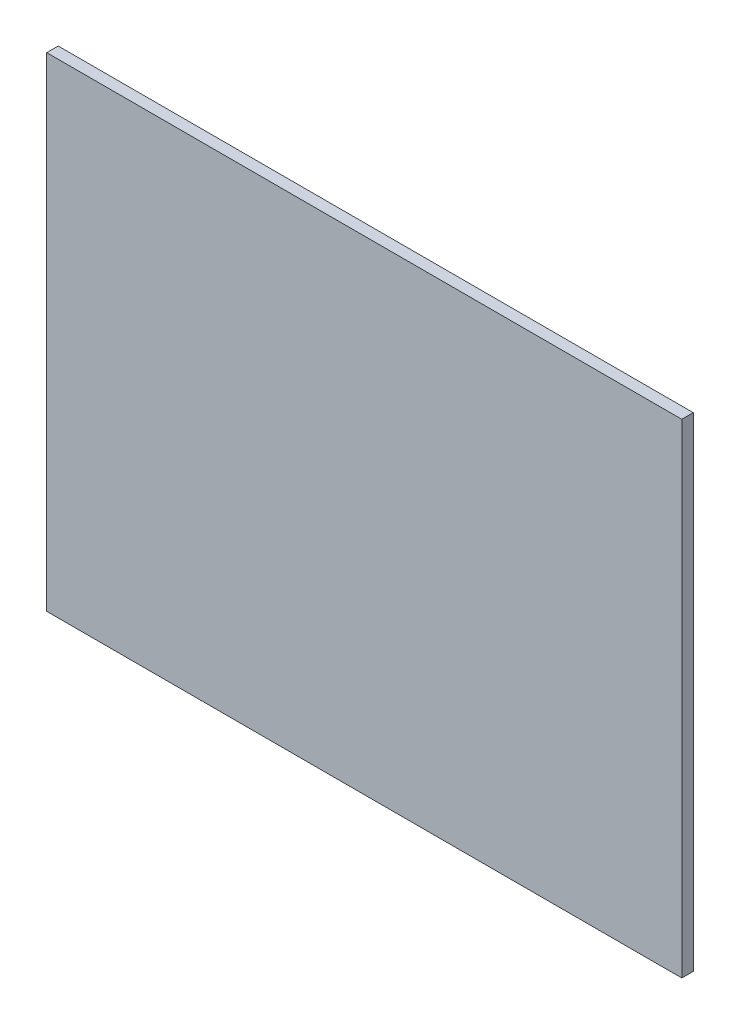
ISO-10303-21;
HEADER;
FILE_DESCRIPTION(('STEP AP214'),'2;1');
FILE_NAME('part.step','',(''),(''),'','','');
FILE_SCHEMA(('AUTOMOTIVE_DESIGN { 1 0 10303 214 1 1 1 1 }'));
ENDSEC;
DATA;
#1=APPLICATION_CONTEXT('core data for automotive mechanical design processes');
#2=APPLICATION_PROTOCOL_DEFINITION('international standard','automotive_design',2000,#1);
#3=PRODUCT_CONTEXT('',#1,'mechanical');
#4=PRODUCT('Part','Part','',(#3));
#5=PRODUCT_RELATED_PRODUCT_CATEGORY('part','',(#4));
#6=PRODUCT_DEFINITION_FORMATION('','',#4);
#7=PRODUCT_DEFINITION_CONTEXT('part definition',#1,'design');
#8=PRODUCT_DEFINITION('design','',#6,#7);
#9=PRODUCT_DEFINITION_SHAPE('','',#8);
#10=(LENGTH_UNIT() NAMED_UNIT(*) SI_UNIT(.MILLI.,.METRE.));
#11=(NAMED_UNIT(*) PLANE_ANGLE_UNIT() SI_UNIT($,.RADIAN.));
#12=(NAMED_UNIT(*) SI_UNIT($,.STERADIAN.) SOLID_ANGLE_UNIT());
#13=UNCERTAINTY_MEASURE_WITH_UNIT(LENGTH_MEASURE(1.E-05),#10,'distance_accuracy_value','');
#14=(GEOMETRIC_REPRESENTATION_CONTEXT(3) GLOBAL_UNCERTAINTY_ASSIGNED_CONTEXT((#13)) GLOBAL_UNIT_ASSIGNED_CONTEXT((#10,
#11,#12)) REPRESENTATION_CONTEXT('',''));
#15=CARTESIAN_POINT('',(0.,0.,0.));
#16=DIRECTION('',(0.,0.,1.));
#17=DIRECTION('',(1.,0.,0.));
#18=AXIS2_PLACEMENT_3D('',#15,#16,#17);
#19=CARTESIAN_POINT('',(-525.,400.,9.5));
#20=DIRECTION('',(1.,0.,0.));
#21=DIRECTION('',(0.,1.,0.));
#22=AXIS2_PLACEMENT_3D('',#19,#20,#21);
#23=PLANE('',#22);
#24=DIRECTION('',(0.,-1.,0.));
#25=VECTOR('',#24,1.);
#26=CARTESIAN_POINT('',(-525.,400.,-9.5));
#27=LINE('',#26,#25);
#28=CARTESIAN_POINT('',(-525.,400.,-9.5));
#29=VERTEX_POINT('',#28);
#30=CARTESIAN_POINT('',(-525.,-400.,-9.5));
#31=VERTEX_POINT('',#30);
#32=EDGE_CURVE('E96',#29,#31,#27,.T.);
#33=ORIENTED_EDGE('',*,*,#32,.T.);
#34=DIRECTION('',(0.,0.,-1.));
#35=VECTOR('',#34,1.);
#36=CARTESIAN_POINT('',(-525.,-400.,9.5));
#37=LINE('',#36,#35);
#38=CARTESIAN_POINT('',(-525.,-400.,9.5));
#39=VERTEX_POINT('',#38);
#40=EDGE_CURVE('E11',#39,#31,#37,.T.);
#41=ORIENTED_EDGE('',*,*,#40,.F.);
#42=DIRECTION('',(0.,-1.,0.));
#43=VECTOR('',#42,1.);
#44=CARTESIAN_POINT('',(-525.,400.,9.5));
#45=LINE('',#44,#43);
#46=CARTESIAN_POINT('',(-525.,400.,9.5));
#47=VERTEX_POINT('',#46);
#48=EDGE_CURVE('E84',#47,#39,#45,.T.);
#49=ORIENTED_EDGE('',*,*,#48,.F.);
#50=DIRECTION('',(0.,0.,-1.));
#51=VECTOR('',#50,1.);
#52=CARTESIAN_POINT('',(-525.,400.,9.5));
#53=LINE('',#52,#51);
#54=EDGE_CURVE('E92',#47,#29,#53,.T.);
#55=ORIENTED_EDGE('',*,*,#54,.T.);
#56=EDGE_LOOP('',(#33,#41,#49,#55));
#57=FACE_BOUND('',#56,.T.);
#58=ADVANCED_FACE('F33',(#57),#23,.F.);
#59=CARTESIAN_POINT('',(525.,-400.,9.5));
#60=DIRECTION('',(0.,1.,0.));
#61=DIRECTION('',(-1.,0.,0.));
#62=AXIS2_PLACEMENT_3D('',#59,#60,#61);
#63=PLANE('',#62);
#64=DIRECTION('',(1.,0.,0.));
#65=VECTOR('',#64,1.);
#66=CARTESIAN_POINT('',(525.,-400.,-9.5));
#67=LINE('',#66,#65);
#68=CARTESIAN_POINT('',(525.,-400.,-9.5));
#69=VERTEX_POINT('',#68);
#70=EDGE_CURVE('E88',#31,#69,#67,.T.);
#71=ORIENTED_EDGE('',*,*,#70,.T.);
#72=DIRECTION('',(0.,0.,-1.));
#73=VECTOR('',#72,1.);
#74=CARTESIAN_POINT('',(525.,-400.,9.5));
#75=LINE('',#74,#73);
#76=CARTESIAN_POINT('',(525.,-400.,9.5));
#77=VERTEX_POINT('',#76);
#78=EDGE_CURVE('E41',#77,#69,#75,.T.);
#79=ORIENTED_EDGE('',*,*,#78,.F.);
#80=DIRECTION('',(1.,0.,0.));
#81=VECTOR('',#80,1.);
#82=CARTESIAN_POINT('',(525.,-400.,9.5));
#83=LINE('',#82,#81);
#84=EDGE_CURVE('E79',#39,#77,#83,.T.);
#85=ORIENTED_EDGE('',*,*,#84,.F.);
#86=ORIENTED_EDGE('',*,*,#40,.T.);
#87=EDGE_LOOP('',(#71,#79,#85,#86));
#88=FACE_BOUND('',#87,.T.);
#89=ADVANCED_FACE('F87',(#88),#63,.F.);
#90=CARTESIAN_POINT('',(525.,400.,9.5));
#91=DIRECTION('',(-1.,0.,0.));
#92=DIRECTION('',(0.,-1.,0.));
#93=AXIS2_PLACEMENT_3D('',#90,#91,#92);
#94=PLANE('',#93);
#95=DIRECTION('',(0.,1.,0.));
#96=VECTOR('',#95,1.);
#97=CARTESIAN_POINT('',(525.,400.,-9.5));
#98=LINE('',#97,#96);
#99=CARTESIAN_POINT('',(525.,400.,-9.5));
#100=VERTEX_POINT('',#99);
#101=EDGE_CURVE('E66',#69,#100,#98,.T.);
#102=ORIENTED_EDGE('',*,*,#101,.T.);
#103=DIRECTION('',(0.,0.,-1.));
#104=VECTOR('',#103,1.);
#105=CARTESIAN_POINT('',(525.,400.,9.5));
#106=LINE('',#105,#104);
#107=CARTESIAN_POINT('',(525.,400.,9.5));
#108=VERTEX_POINT('',#107);
#109=EDGE_CURVE('E89',#108,#100,#106,.T.);
#110=ORIENTED_EDGE('',*,*,#109,.F.);
#111=DIRECTION('',(0.,1.,0.));
#112=VECTOR('',#111,1.);
#113=CARTESIAN_POINT('',(525.,400.,9.5));
#114=LINE('',#113,#112);
#115=EDGE_CURVE('E82',#77,#108,#114,.T.);
#116=ORIENTED_EDGE('',*,*,#115,.F.);
#117=ORIENTED_EDGE('',*,*,#78,.T.);
#118=EDGE_LOOP('',(#102,#110,#116,#117));
#119=FACE_BOUND('',#118,.T.);
#120=ADVANCED_FACE('F90',(#119),#94,.F.);
#121=CARTESIAN_POINT('',(525.,400.,9.5));
#122=DIRECTION('',(0.,-1.,0.));
#123=DIRECTION('',(1.,0.,0.));
#124=AXIS2_PLACEMENT_3D('',#121,#122,#123);
#125=PLANE('',#124);
#126=DIRECTION('',(-1.,0.,0.));
#127=VECTOR('',#126,1.);
#128=CARTESIAN_POINT('',(525.,400.,-9.5));
#129=LINE('',#128,#127);
#130=EDGE_CURVE('E72',#100,#29,#129,.T.);
#131=ORIENTED_EDGE('',*,*,#130,.T.);
#132=ORIENTED_EDGE('',*,*,#54,.F.);
#133=DIRECTION('',(-1.,0.,0.));
#134=VECTOR('',#133,1.);
#135=CARTESIAN_POINT('',(525.,400.,9.5));
#136=LINE('',#135,#134);
#137=EDGE_CURVE('E49',#108,#47,#136,.T.);
#138=ORIENTED_EDGE('',*,*,#137,.F.);
#139=ORIENTED_EDGE('',*,*,#109,.T.);
#140=EDGE_LOOP('',(#131,#132,#138,#139));
#141=FACE_BOUND('',#140,.T.);
#142=ADVANCED_FACE('F103',(#141),#125,.F.);
#143=CARTESIAN_POINT('',(0.,0.,9.5));
#144=DIRECTION('',(0.,0.,-1.));
#145=DIRECTION('',(-1.,0.,0.));
#146=AXIS2_PLACEMENT_3D('',#143,#144,#145);
#147=PLANE('',#146);
#148=ORIENTED_EDGE('',*,*,#48,.T.);
#149=ORIENTED_EDGE('',*,*,#84,.T.);
#150=ORIENTED_EDGE('',*,*,#115,.T.);
#151=ORIENTED_EDGE('',*,*,#137,.T.);
#152=EDGE_LOOP('',(#148,#149,#150,#151));
#153=FACE_BOUND('',#152,.T.);
#154=ADVANCED_FACE('F80',(#153),#147,.F.);
#155=CARTESIAN_POINT('',(0.,0.,-9.5));
#156=DIRECTION('',(0.,0.,-1.));
#157=DIRECTION('',(-1.,0.,0.));
#158=AXIS2_PLACEMENT_3D('',#155,#156,#157);
#159=PLANE('',#158);
#160=ORIENTED_EDGE('',*,*,#32,.F.);
#161=ORIENTED_EDGE('',*,*,#130,.F.);
#162=ORIENTED_EDGE('',*,*,#101,.F.);
#163=ORIENTED_EDGE('',*,*,#70,.F.);
#164=EDGE_LOOP('',(#160,#161,#162,#163));
#165=FACE_BOUND('',#164,.T.);
#166=ADVANCED_FACE('F106',(#165),#159,.T.);
#167=CLOSED_SHELL('',(#58,#89,#120,#142,#154,#166));
#168=MANIFOLD_SOLID_BREP('B2',#167);
#169=ADVANCED_BREP_SHAPE_REPRESENTATION('',(#18,#168),#14);
#170=SHAPE_DEFINITION_REPRESENTATION(#9,#169);
ENDSEC;
END-ISO-10303-21;
